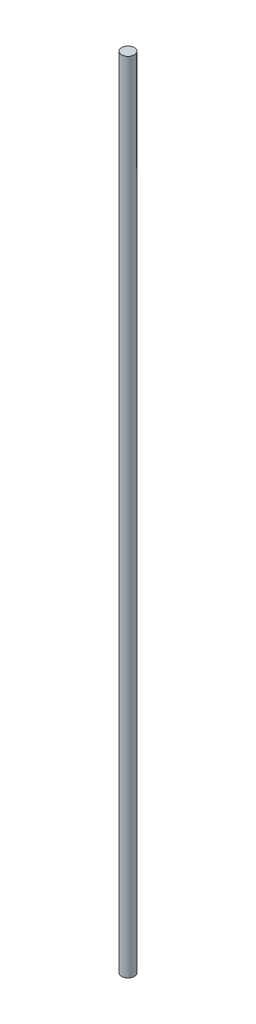
ISO-10303-21;
HEADER;
FILE_DESCRIPTION(('STEP AP214'),'2;1');
FILE_NAME('part.step','',(''),(''),'','','');
FILE_SCHEMA(('AUTOMOTIVE_DESIGN { 1 0 10303 214 1 1 1 1 }'));
ENDSEC;
DATA;
#1=APPLICATION_CONTEXT('core data for automotive mechanical design processes');
#2=APPLICATION_PROTOCOL_DEFINITION('international standard','automotive_design',2000,#1);
#3=PRODUCT_CONTEXT('',#1,'mechanical');
#4=PRODUCT('Part','Part','',(#3));
#5=PRODUCT_RELATED_PRODUCT_CATEGORY('part','',(#4));
#6=PRODUCT_DEFINITION_FORMATION('','',#4);
#7=PRODUCT_DEFINITION_CONTEXT('part definition',#1,'design');
#8=PRODUCT_DEFINITION('design','',#6,#7);
#9=PRODUCT_DEFINITION_SHAPE('','',#8);
#10=(LENGTH_UNIT() NAMED_UNIT(*) SI_UNIT(.MILLI.,.METRE.));
#11=(NAMED_UNIT(*) PLANE_ANGLE_UNIT() SI_UNIT($,.RADIAN.));
#12=(NAMED_UNIT(*) SI_UNIT($,.STERADIAN.) SOLID_ANGLE_UNIT());
#13=UNCERTAINTY_MEASURE_WITH_UNIT(LENGTH_MEASURE(1.E-05),#10,'distance_accuracy_value','');
#14=(GEOMETRIC_REPRESENTATION_CONTEXT(3) GLOBAL_UNCERTAINTY_ASSIGNED_CONTEXT((#13)) GLOBAL_UNIT_ASSIGNED_CONTEXT((#10,
#11,#12)) REPRESENTATION_CONTEXT('',''));
#15=CARTESIAN_POINT('',(0.,0.,0.));
#16=DIRECTION('',(0.,0.,1.));
#17=DIRECTION('',(1.,0.,0.));
#18=AXIS2_PLACEMENT_3D('',#15,#16,#17);
#19=CARTESIAN_POINT('',(0.,755.,0.));
#20=DIRECTION('',(0.,-1.,0.));
#21=DIRECTION('',(0.,0.,-1.));
#22=AXIS2_PLACEMENT_3D('',#19,#20,#21);
#23=CYLINDRICAL_SURFACE('',#22,6.);
#24=CARTESIAN_POINT('',(0.,755.,0.));
#25=DIRECTION('',(0.,1.,0.));
#26=DIRECTION('',(0.,0.,1.));
#27=AXIS2_PLACEMENT_3D('',#24,#25,#26);
#28=CIRCLE('',#27,6.);
#29=CARTESIAN_POINT('',(0.,755.,6.));
#30=VERTEX_POINT('',#29);
#31=EDGE_CURVE('E10',#30,#30,#28,.T.);
#32=ORIENTED_EDGE('',*,*,#31,.F.);
#33=EDGE_LOOP('',(#32));
#34=FACE_BOUND('',#33,.T.);
#35=CARTESIAN_POINT('',(0.,0.,0.));
#36=DIRECTION('',(0.,1.,0.));
#37=DIRECTION('',(0.,0.,1.));
#38=AXIS2_PLACEMENT_3D('',#35,#36,#37);
#39=CIRCLE('',#38,6.);
#40=CARTESIAN_POINT('',(0.,0.,6.));
#41=VERTEX_POINT('',#40);
#42=EDGE_CURVE('E48',#41,#41,#39,.T.);
#43=ORIENTED_EDGE('',*,*,#42,.T.);
#44=EDGE_LOOP('',(#43));
#45=FACE_BOUND('',#44,.T.);
#46=ADVANCED_FACE('F45',(#34,#45),#23,.T.);
#47=CARTESIAN_POINT('',(0.,755.,0.));
#48=DIRECTION('',(0.,1.,0.));
#49=DIRECTION('',(0.,0.,1.));
#50=AXIS2_PLACEMENT_3D('',#47,#48,#49);
#51=PLANE('',#50);
#52=ORIENTED_EDGE('',*,*,#31,.T.);
#53=EDGE_LOOP('',(#52));
#54=FACE_BOUND('',#53,.T.);
#55=ADVANCED_FACE('F62',(#54),#51,.T.);
#56=CARTESIAN_POINT('',(0.,0.,0.));
#57=DIRECTION('',(0.,1.,0.));
#58=DIRECTION('',(0.,0.,1.));
#59=AXIS2_PLACEMENT_3D('',#56,#57,#58);
#60=PLANE('',#59);
#61=ORIENTED_EDGE('',*,*,#42,.F.);
#62=EDGE_LOOP('',(#61));
#63=FACE_BOUND('',#62,.T.);
#64=ADVANCED_FACE('F60',(#63),#60,.F.);
#65=CLOSED_SHELL('',(#46,#55,#64));
#66=MANIFOLD_SOLID_BREP('B2',#65);
#67=ADVANCED_BREP_SHAPE_REPRESENTATION('',(#18,#66),#14);
#68=SHAPE_DEFINITION_REPRESENTATION(#9,#67);
ENDSEC;
END-ISO-10303-21;
